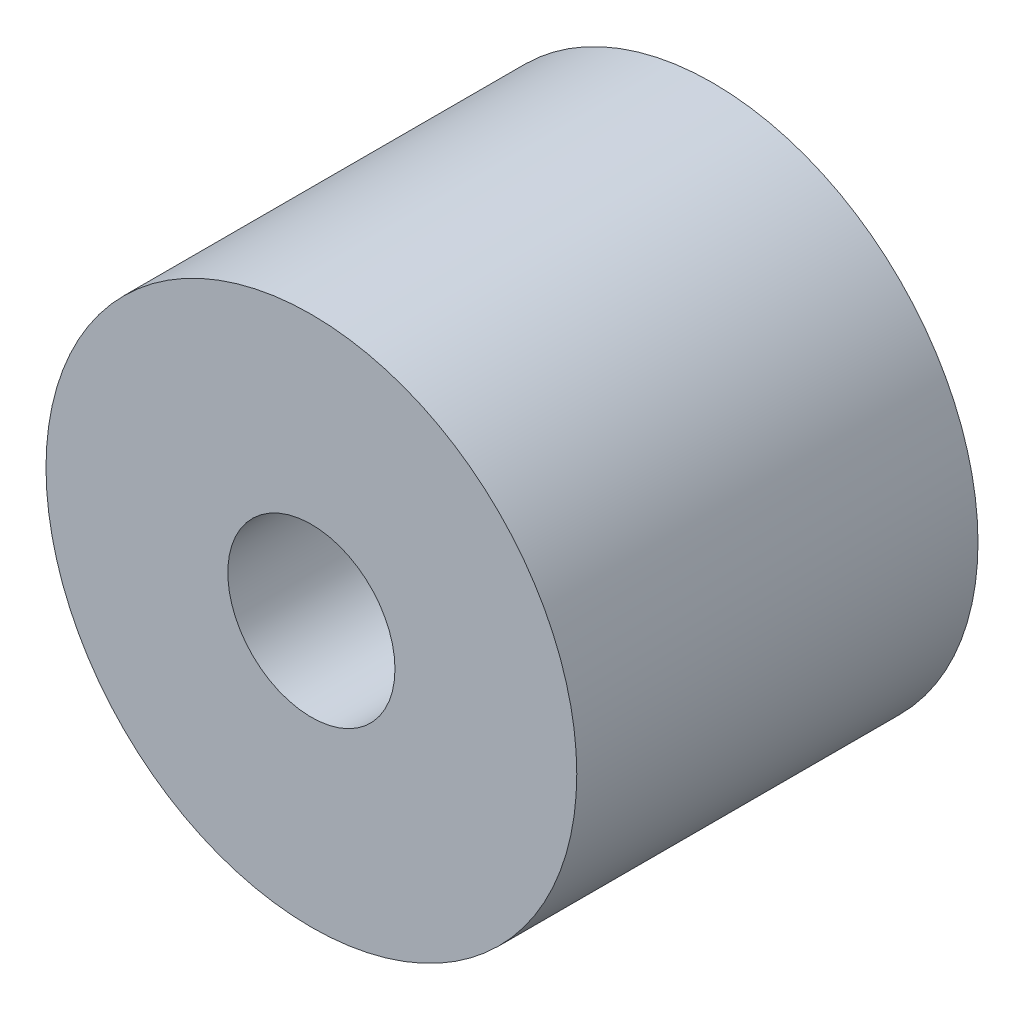
ISO-10303-21;
HEADER;
FILE_DESCRIPTION(('STEP AP214'),'2;1');
FILE_NAME('part.step','',(''),(''),'','','');
FILE_SCHEMA(('AUTOMOTIVE_DESIGN { 1 0 10303 214 1 1 1 1 }'));
ENDSEC;
DATA;
#1=APPLICATION_CONTEXT('core data for automotive mechanical design processes');
#2=APPLICATION_PROTOCOL_DEFINITION('international standard','automotive_design',2000,#1);
#3=PRODUCT_CONTEXT('',#1,'mechanical');
#4=PRODUCT('Part','Part','',(#3));
#5=PRODUCT_RELATED_PRODUCT_CATEGORY('part','',(#4));
#6=PRODUCT_DEFINITION_FORMATION('','',#4);
#7=PRODUCT_DEFINITION_CONTEXT('part definition',#1,'design');
#8=PRODUCT_DEFINITION('design','',#6,#7);
#9=PRODUCT_DEFINITION_SHAPE('','',#8);
#10=(LENGTH_UNIT() NAMED_UNIT(*) SI_UNIT(.MILLI.,.METRE.));
#11=(NAMED_UNIT(*) PLANE_ANGLE_UNIT() SI_UNIT($,.RADIAN.));
#12=(NAMED_UNIT(*) SI_UNIT($,.STERADIAN.) SOLID_ANGLE_UNIT());
#13=UNCERTAINTY_MEASURE_WITH_UNIT(LENGTH_MEASURE(1.E-05),#10,'distance_accuracy_value','');
#14=(GEOMETRIC_REPRESENTATION_CONTEXT(3) GLOBAL_UNCERTAINTY_ASSIGNED_CONTEXT((#13)) GLOBAL_UNIT_ASSIGNED_CONTEXT((#10,
#11,#12)) REPRESENTATION_CONTEXT('',''));
#15=CARTESIAN_POINT('',(0.,0.,0.));
#16=DIRECTION('',(0.,0.,1.));
#17=DIRECTION('',(1.,0.,0.));
#18=AXIS2_PLACEMENT_3D('',#15,#16,#17);
#19=CARTESIAN_POINT('',(0.,0.,6.));
#20=DIRECTION('',(0.,0.,-1.));
#21=DIRECTION('',(-1.,0.,0.));
#22=AXIS2_PLACEMENT_3D('',#19,#20,#21);
#23=CYLINDRICAL_SURFACE('',#22,3.96875);
#24=CARTESIAN_POINT('',(0.,0.,6.));
#25=DIRECTION('',(0.,0.,1.));
#26=DIRECTION('',(1.,0.,0.));
#27=AXIS2_PLACEMENT_3D('',#24,#25,#26);
#28=CIRCLE('',#27,3.96875);
#29=CARTESIAN_POINT('',(3.96875,0.,6.));
#30=VERTEX_POINT('',#29);
#31=EDGE_CURVE('E10',#30,#30,#28,.T.);
#32=ORIENTED_EDGE('',*,*,#31,.F.);
#33=EDGE_LOOP('',(#32));
#34=FACE_BOUND('',#33,.T.);
#35=CARTESIAN_POINT('',(0.,0.,0.));
#36=DIRECTION('',(0.,0.,1.));
#37=DIRECTION('',(1.,0.,0.));
#38=AXIS2_PLACEMENT_3D('',#35,#36,#37);
#39=CIRCLE('',#38,3.96875);
#40=CARTESIAN_POINT('',(3.96875,0.,0.));
#41=VERTEX_POINT('',#40);
#42=EDGE_CURVE('E46',#41,#41,#39,.T.);
#43=ORIENTED_EDGE('',*,*,#42,.T.);
#44=EDGE_LOOP('',(#43));
#45=FACE_BOUND('',#44,.T.);
#46=ADVANCED_FACE('F43',(#34,#45),#23,.T.);
#47=CARTESIAN_POINT('',(0.,0.,6.));
#48=DIRECTION('',(0.,0.,1.));
#49=DIRECTION('',(1.,0.,0.));
#50=AXIS2_PLACEMENT_3D('',#47,#48,#49);
#51=PLANE('',#50);
#52=CARTESIAN_POINT('',(0.,0.,6.));
#53=DIRECTION('',(0.,0.,1.));
#54=DIRECTION('',(1.,0.,0.));
#55=AXIS2_PLACEMENT_3D('',#52,#53,#54);
#56=CIRCLE('',#55,1.25);
#57=CARTESIAN_POINT('',(1.25,0.,6.));
#58=VERTEX_POINT('',#57);
#59=EDGE_CURVE('E60',#58,#58,#56,.T.);
#60=ORIENTED_EDGE('',*,*,#59,.F.);
#61=EDGE_LOOP('',(#60));
#62=FACE_BOUND('',#61,.T.);
#63=ORIENTED_EDGE('',*,*,#31,.T.);
#64=EDGE_LOOP('',(#63));
#65=FACE_BOUND('',#64,.T.);
#66=ADVANCED_FACE('F67',(#62,#65),#51,.T.);
#67=CARTESIAN_POINT('',(0.,0.,0.));
#68=DIRECTION('',(0.,0.,1.));
#69=DIRECTION('',(1.,0.,0.));
#70=AXIS2_PLACEMENT_3D('',#67,#68,#69);
#71=PLANE('',#70);
#72=CARTESIAN_POINT('',(0.,0.,0.));
#73=DIRECTION('',(0.,0.,1.));
#74=DIRECTION('',(1.,0.,0.));
#75=AXIS2_PLACEMENT_3D('',#72,#73,#74);
#76=CIRCLE('',#75,1.25);
#77=CARTESIAN_POINT('',(1.25,0.,0.));
#78=VERTEX_POINT('',#77);
#79=EDGE_CURVE('E55',#78,#78,#76,.T.);
#80=ORIENTED_EDGE('',*,*,#79,.T.);
#81=EDGE_LOOP('',(#80));
#82=FACE_BOUND('',#81,.T.);
#83=ORIENTED_EDGE('',*,*,#42,.F.);
#84=EDGE_LOOP('',(#83));
#85=FACE_BOUND('',#84,.T.);
#86=ADVANCED_FACE('F69',(#82,#85),#71,.F.);
#87=CARTESIAN_POINT('',(0.,0.,6.));
#88=DIRECTION('',(0.,0.,1.));
#89=DIRECTION('',(1.,0.,0.));
#90=AXIS2_PLACEMENT_3D('',#87,#88,#89);
#91=CYLINDRICAL_SURFACE('',#90,1.25);
#92=ORIENTED_EDGE('',*,*,#79,.F.);
#93=EDGE_LOOP('',(#92));
#94=FACE_BOUND('',#93,.T.);
#95=ORIENTED_EDGE('',*,*,#59,.T.);
#96=EDGE_LOOP('',(#95));
#97=FACE_BOUND('',#96,.T.);
#98=ADVANCED_FACE('F65',(#94,#97),#91,.F.);
#99=CLOSED_SHELL('',(#46,#66,#86,#98));
#100=MANIFOLD_SOLID_BREP('B2',#99);
#101=ADVANCED_BREP_SHAPE_REPRESENTATION('',(#18,#100),#14);
#102=SHAPE_DEFINITION_REPRESENTATION(#9,#101);
ENDSEC;
END-ISO-10303-21;
